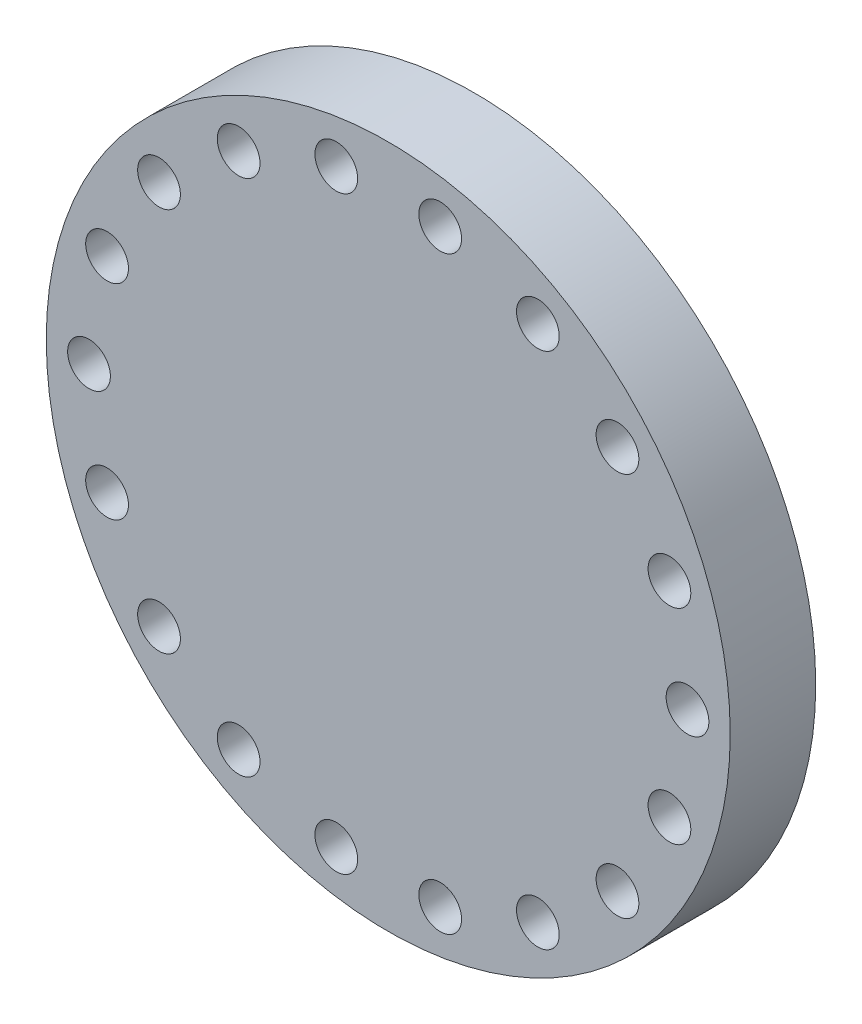
ISO-10303-21;
HEADER;
FILE_DESCRIPTION(('STEP AP214'),'2;1');
FILE_NAME('part.step','',(''),(''),'','','');
FILE_SCHEMA(('AUTOMOTIVE_DESIGN { 1 0 10303 214 1 1 1 1 }'));
ENDSEC;
DATA;
#1=APPLICATION_CONTEXT('core data for automotive mechanical design processes');
#2=APPLICATION_PROTOCOL_DEFINITION('international standard','automotive_design',2000,#1);
#3=PRODUCT_CONTEXT('',#1,'mechanical');
#4=PRODUCT('Part','Part','',(#3));
#5=PRODUCT_RELATED_PRODUCT_CATEGORY('part','',(#4));
#6=PRODUCT_DEFINITION_FORMATION('','',#4);
#7=PRODUCT_DEFINITION_CONTEXT('part definition',#1,'design');
#8=PRODUCT_DEFINITION('design','',#6,#7);
#9=PRODUCT_DEFINITION_SHAPE('','',#8);
#10=(LENGTH_UNIT() NAMED_UNIT(*) SI_UNIT(.MILLI.,.METRE.));
#11=(NAMED_UNIT(*) PLANE_ANGLE_UNIT() SI_UNIT($,.RADIAN.));
#12=(NAMED_UNIT(*) SI_UNIT($,.STERADIAN.) SOLID_ANGLE_UNIT());
#13=UNCERTAINTY_MEASURE_WITH_UNIT(LENGTH_MEASURE(1.E-05),#10,'distance_accuracy_value','');
#14=(GEOMETRIC_REPRESENTATION_CONTEXT(3) GLOBAL_UNCERTAINTY_ASSIGNED_CONTEXT((#13)) GLOBAL_UNIT_ASSIGNED_CONTEXT((#10,
#11,#12)) REPRESENTATION_CONTEXT('',''));
#15=CARTESIAN_POINT('',(0.,0.,0.));
#16=DIRECTION('',(0.,0.,1.));
#17=DIRECTION('',(1.,0.,0.));
#18=AXIS2_PLACEMENT_3D('',#15,#16,#17);
#19=CARTESIAN_POINT('',(0.,0.,-12.7));
#20=DIRECTION('',(0.,0.,1.));
#21=DIRECTION('',(1.,0.,0.));
#22=AXIS2_PLACEMENT_3D('',#19,#20,#21);
#23=CYLINDRICAL_SURFACE('',#22,50.8);
#24=CARTESIAN_POINT('',(0.,0.,-12.7));
#25=DIRECTION('',(0.,0.,1.));
#26=DIRECTION('',(1.,0.,0.));
#27=AXIS2_PLACEMENT_3D('',#24,#25,#26);
#28=CIRCLE('',#27,50.8);
#29=CARTESIAN_POINT('',(50.8,0.,-12.7));
#30=VERTEX_POINT('',#29);
#31=EDGE_CURVE('E10',#30,#30,#28,.T.);
#32=ORIENTED_EDGE('',*,*,#31,.T.);
#33=EDGE_LOOP('',(#32));
#34=FACE_BOUND('',#33,.T.);
#35=CARTESIAN_POINT('',(0.,0.,0.));
#36=DIRECTION('',(0.,0.,1.));
#37=DIRECTION('',(1.,0.,0.));
#38=AXIS2_PLACEMENT_3D('',#35,#36,#37);
#39=CIRCLE('',#38,50.8);
#40=CARTESIAN_POINT('',(50.8,0.,0.));
#41=VERTEX_POINT('',#40);
#42=EDGE_CURVE('E43',#41,#41,#39,.T.);
#43=ORIENTED_EDGE('',*,*,#42,.F.);
#44=EDGE_LOOP('',(#43));
#45=FACE_BOUND('',#44,.T.);
#46=ADVANCED_FACE('F40',(#34,#45),#23,.T.);
#47=CARTESIAN_POINT('',(0.,0.,-12.7));
#48=DIRECTION('',(0.,0.,1.));
#49=DIRECTION('',(1.,0.,0.));
#50=AXIS2_PLACEMENT_3D('',#47,#48,#49);
#51=PLANE('',#50);
#52=CARTESIAN_POINT('',(-41.7693369939334,15.2027953708266,-12.7));
#53=DIRECTION('',(0.,0.,1.));
#54=DIRECTION('',(1.,0.,0.));
#55=AXIS2_PLACEMENT_3D('',#52,#53,#54);
#56=CIRCLE('',#55,3.175);
#57=CARTESIAN_POINT('',(-38.5943369939334,15.2027953708266,-12.7));
#58=VERTEX_POINT('',#57);
#59=EDGE_CURVE('E149',#58,#58,#56,.T.);
#60=ORIENTED_EDGE('',*,*,#59,.T.);
#61=EDGE_LOOP('',(#60));
#62=FACE_BOUND('',#61,.T.);
#63=CARTESIAN_POINT('',(-34.0506754966385,28.5719092505667,-12.7));
#64=DIRECTION('',(0.,0.,1.));
#65=DIRECTION('',(1.,0.,0.));
#66=AXIS2_PLACEMENT_3D('',#63,#64,#65);
#67=CIRCLE('',#66,3.17499999999999);
#68=CARTESIAN_POINT('',(-30.8756754966385,28.5719092505667,-12.7));
#69=VERTEX_POINT('',#68);
#70=EDGE_CURVE('E143',#69,#69,#67,.T.);
#71=ORIENTED_EDGE('',*,*,#70,.T.);
#72=EDGE_LOOP('',(#71));
#73=FACE_BOUND('',#72,.T.);
#74=CARTESIAN_POINT('',(-22.2249999999999,38.4948291982184,-12.7));
#75=DIRECTION('',(0.,0.,1.));
#76=DIRECTION('',(1.,0.,0.));
#77=AXIS2_PLACEMENT_3D('',#74,#75,#76);
#78=CIRCLE('',#77,3.175);
#79=CARTESIAN_POINT('',(-19.0499999999999,38.4948291982184,-12.7));
#80=VERTEX_POINT('',#79);
#81=EDGE_CURVE('E137',#80,#80,#78,.T.);
#82=ORIENTED_EDGE('',*,*,#81,.T.);
#83=EDGE_LOOP('',(#82));
#84=FACE_BOUND('',#83,.T.);
#85=CARTESIAN_POINT('',(-7.71866149729492,43.7747046213927,-12.7));
#86=DIRECTION('',(0.,0.,1.));
#87=DIRECTION('',(1.,0.,0.));
#88=AXIS2_PLACEMENT_3D('',#85,#86,#87);
#89=CIRCLE('',#88,3.17499999999999);
#90=CARTESIAN_POINT('',(-4.54366149729493,43.7747046213927,-12.7));
#91=VERTEX_POINT('',#90);
#92=EDGE_CURVE('E131',#91,#91,#89,.T.);
#93=ORIENTED_EDGE('',*,*,#92,.T.);
#94=EDGE_LOOP('',(#93));
#95=FACE_BOUND('',#94,.T.);
#96=CARTESIAN_POINT('',(7.71866149729522,43.7747046213926,-12.7));
#97=DIRECTION('',(0.,0.,1.));
#98=DIRECTION('',(1.,0.,0.));
#99=AXIS2_PLACEMENT_3D('',#96,#97,#98);
#100=CIRCLE('',#99,3.17499999999999);
#101=CARTESIAN_POINT('',(10.8936614972952,43.7747046213926,-12.7));
#102=VERTEX_POINT('',#101);
#103=EDGE_CURVE('E125',#102,#102,#100,.T.);
#104=ORIENTED_EDGE('',*,*,#103,.T.);
#105=EDGE_LOOP('',(#104));
#106=FACE_BOUND('',#105,.T.);
#107=CARTESIAN_POINT('',(22.2250000000002,38.4948291982182,-12.7));
#108=DIRECTION('',(0.,0.,1.));
#109=DIRECTION('',(1.,0.,0.));
#110=AXIS2_PLACEMENT_3D('',#107,#108,#109);
#111=CIRCLE('',#110,3.17500000000001);
#112=CARTESIAN_POINT('',(25.4000000000002,38.4948291982182,-12.7));
#113=VERTEX_POINT('',#112);
#114=EDGE_CURVE('E119',#113,#113,#111,.T.);
#115=ORIENTED_EDGE('',*,*,#114,.T.);
#116=EDGE_LOOP('',(#115));
#117=FACE_BOUND('',#116,.T.);
#118=CARTESIAN_POINT('',(34.0506754966387,28.5719092505665,-12.7));
#119=DIRECTION('',(0.,0.,1.));
#120=DIRECTION('',(1.,0.,0.));
#121=AXIS2_PLACEMENT_3D('',#118,#119,#120);
#122=CIRCLE('',#121,3.175);
#123=CARTESIAN_POINT('',(37.2256754966387,28.5719092505665,-12.7));
#124=VERTEX_POINT('',#123);
#125=EDGE_CURVE('E113',#124,#124,#122,.T.);
#126=ORIENTED_EDGE('',*,*,#125,.T.);
#127=EDGE_LOOP('',(#126));
#128=FACE_BOUND('',#127,.T.);
#129=CARTESIAN_POINT('',(41.7693369939337,15.2027953708257,-12.7));
#130=DIRECTION('',(0.,0.,1.));
#131=DIRECTION('',(1.,0.,0.));
#132=AXIS2_PLACEMENT_3D('',#129,#130,#131);
#133=CIRCLE('',#132,3.17499999999999);
#134=CARTESIAN_POINT('',(44.9443369939337,15.2027953708257,-12.7));
#135=VERTEX_POINT('',#134);
#136=EDGE_CURVE('E107',#135,#135,#133,.T.);
#137=ORIENTED_EDGE('',*,*,#136,.T.);
#138=EDGE_LOOP('',(#137));
#139=FACE_BOUND('',#138,.T.);
#140=CARTESIAN_POINT('',(44.45,-3.10392691023155E-13,-12.7));
#141=DIRECTION('',(0.,0.,1.));
#142=DIRECTION('',(1.,0.,0.));
#143=AXIS2_PLACEMENT_3D('',#140,#141,#142);
#144=CIRCLE('',#143,3.175);
#145=CARTESIAN_POINT('',(47.625,-3.10392691023155E-13,-12.7));
#146=VERTEX_POINT('',#145);
#147=EDGE_CURVE('E101',#146,#146,#144,.T.);
#148=ORIENTED_EDGE('',*,*,#147,.T.);
#149=EDGE_LOOP('',(#148));
#150=FACE_BOUND('',#149,.T.);
#151=CARTESIAN_POINT('',(41.7693369939335,-15.2027953708263,-12.7));
#152=DIRECTION('',(0.,0.,1.));
#153=DIRECTION('',(1.,0.,0.));
#154=AXIS2_PLACEMENT_3D('',#151,#152,#153);
#155=CIRCLE('',#154,3.17499999999999);
#156=CARTESIAN_POINT('',(44.9443369939335,-15.2027953708263,-12.7));
#157=VERTEX_POINT('',#156);
#158=EDGE_CURVE('E95',#157,#157,#155,.T.);
#159=ORIENTED_EDGE('',*,*,#158,.T.);
#160=EDGE_LOOP('',(#159));
#161=FACE_BOUND('',#160,.T.);
#162=CARTESIAN_POINT('',(34.0506754966383,-28.571909250567,-12.7));
#163=DIRECTION('',(0.,0.,1.));
#164=DIRECTION('',(1.,0.,0.));
#165=AXIS2_PLACEMENT_3D('',#162,#163,#164);
#166=CIRCLE('',#165,3.175);
#167=CARTESIAN_POINT('',(37.2256754966383,-28.571909250567,-12.7));
#168=VERTEX_POINT('',#167);
#169=EDGE_CURVE('E89',#168,#168,#166,.T.);
#170=ORIENTED_EDGE('',*,*,#169,.T.);
#171=EDGE_LOOP('',(#170));
#172=FACE_BOUND('',#171,.T.);
#173=CARTESIAN_POINT('',(22.2249999999996,-38.4948291982185,-12.7));
#174=DIRECTION('',(0.,0.,1.));
#175=DIRECTION('',(1.,0.,0.));
#176=AXIS2_PLACEMENT_3D('',#173,#174,#175);
#177=CIRCLE('',#176,3.175);
#178=CARTESIAN_POINT('',(25.3999999999996,-38.4948291982185,-12.7));
#179=VERTEX_POINT('',#178);
#180=EDGE_CURVE('E83',#179,#179,#177,.T.);
#181=ORIENTED_EDGE('',*,*,#180,.T.);
#182=EDGE_LOOP('',(#181));
#183=FACE_BOUND('',#182,.T.);
#184=CARTESIAN_POINT('',(7.71866149729463,-43.7747046213927,-12.7));
#185=DIRECTION('',(0.,0.,1.));
#186=DIRECTION('',(1.,0.,0.));
#187=AXIS2_PLACEMENT_3D('',#184,#185,#186);
#188=CIRCLE('',#187,3.175);
#189=CARTESIAN_POINT('',(10.8936614972946,-43.7747046213927,-12.7));
#190=VERTEX_POINT('',#189);
#191=EDGE_CURVE('E77',#190,#190,#188,.T.);
#192=ORIENTED_EDGE('',*,*,#191,.T.);
#193=EDGE_LOOP('',(#192));
#194=FACE_BOUND('',#193,.T.);
#195=CARTESIAN_POINT('',(-7.71866149729551,-43.7747046213926,-12.7));
#196=DIRECTION('',(0.,0.,1.));
#197=DIRECTION('',(1.,0.,0.));
#198=AXIS2_PLACEMENT_3D('',#195,#196,#197);
#199=CIRCLE('',#198,3.175);
#200=CARTESIAN_POINT('',(-4.54366149729551,-43.7747046213926,-12.7));
#201=VERTEX_POINT('',#200);
#202=EDGE_CURVE('E71',#201,#201,#199,.T.);
#203=ORIENTED_EDGE('',*,*,#202,.T.);
#204=EDGE_LOOP('',(#203));
#205=FACE_BOUND('',#204,.T.);
#206=CARTESIAN_POINT('',(-22.2250000000005,-38.494829198218,-12.7));
#207=DIRECTION('',(0.,0.,1.));
#208=DIRECTION('',(1.,0.,0.));
#209=AXIS2_PLACEMENT_3D('',#206,#207,#208);
#210=CIRCLE('',#209,3.175);
#211=CARTESIAN_POINT('',(-19.0500000000005,-38.494829198218,-12.7));
#212=VERTEX_POINT('',#211);
#213=EDGE_CURVE('E65',#212,#212,#210,.T.);
#214=ORIENTED_EDGE('',*,*,#213,.T.);
#215=EDGE_LOOP('',(#214));
#216=FACE_BOUND('',#215,.T.);
#217=CARTESIAN_POINT('',(-34.0506754966389,-28.5719092505663,-12.7));
#218=DIRECTION('',(0.,0.,1.));
#219=DIRECTION('',(1.,0.,0.));
#220=AXIS2_PLACEMENT_3D('',#217,#218,#219);
#221=CIRCLE('',#220,3.17499999999999);
#222=CARTESIAN_POINT('',(-30.8756754966389,-28.5719092505663,-12.7));
#223=VERTEX_POINT('',#222);
#224=EDGE_CURVE('E58',#223,#223,#221,.T.);
#225=ORIENTED_EDGE('',*,*,#224,.T.);
#226=EDGE_LOOP('',(#225));
#227=FACE_BOUND('',#226,.T.);
#228=CARTESIAN_POINT('',(-41.7693369939338,-15.2027953708255,-12.7));
#229=DIRECTION('',(0.,0.,1.));
#230=DIRECTION('',(1.,0.,0.));
#231=AXIS2_PLACEMENT_3D('',#228,#229,#230);
#232=CIRCLE('',#231,3.17499999999999);
#233=CARTESIAN_POINT('',(-38.5943369939338,-15.2027953708255,-12.7));
#234=VERTEX_POINT('',#233);
#235=EDGE_CURVE('E154',#234,#234,#232,.T.);
#236=ORIENTED_EDGE('',*,*,#235,.T.);
#237=EDGE_LOOP('',(#236));
#238=FACE_BOUND('',#237,.T.);
#239=CARTESIAN_POINT('',(-44.45,0.,-12.7));
#240=DIRECTION('',(0.,0.,1.));
#241=DIRECTION('',(1.,0.,0.));
#242=AXIS2_PLACEMENT_3D('',#239,#240,#241);
#243=CIRCLE('',#242,3.175);
#244=CARTESIAN_POINT('',(-41.275,0.,-12.7));
#245=VERTEX_POINT('',#244);
#246=EDGE_CURVE('E50',#245,#245,#243,.T.);
#247=ORIENTED_EDGE('',*,*,#246,.T.);
#248=EDGE_LOOP('',(#247));
#249=FACE_BOUND('',#248,.T.);
#250=ORIENTED_EDGE('',*,*,#31,.F.);
#251=EDGE_LOOP('',(#250));
#252=FACE_BOUND('',#251,.T.);
#253=ADVANCED_FACE('F166',(#62,#73,#84,#95,#106,#117,#128,#139,#150,#161,#172,#183,#194,#205,
#216,#227,#238,#249,#252),#51,.F.);
#254=CARTESIAN_POINT('',(0.,0.,0.));
#255=DIRECTION('',(0.,0.,1.));
#256=DIRECTION('',(1.,0.,0.));
#257=AXIS2_PLACEMENT_3D('',#254,#255,#256);
#258=PLANE('',#257);
#259=CARTESIAN_POINT('',(-41.7693369939334,15.2027953708266,0.));
#260=DIRECTION('',(0.,0.,1.));
#261=DIRECTION('',(1.,0.,0.));
#262=AXIS2_PLACEMENT_3D('',#259,#260,#261);
#263=CIRCLE('',#262,3.175);
#264=CARTESIAN_POINT('',(-38.5943369939334,15.2027953708266,0.));
#265=VERTEX_POINT('',#264);
#266=EDGE_CURVE('E55',#265,#265,#263,.T.);
#267=ORIENTED_EDGE('',*,*,#266,.F.);
#268=EDGE_LOOP('',(#267));
#269=FACE_BOUND('',#268,.T.);
#270=CARTESIAN_POINT('',(-34.0506754966385,28.5719092505667,0.));
#271=DIRECTION('',(0.,0.,1.));
#272=DIRECTION('',(1.,0.,0.));
#273=AXIS2_PLACEMENT_3D('',#270,#271,#272);
#274=CIRCLE('',#273,3.17499999999999);
#275=CARTESIAN_POINT('',(-30.8756754966385,28.5719092505667,0.));
#276=VERTEX_POINT('',#275);
#277=EDGE_CURVE('E146',#276,#276,#274,.T.);
#278=ORIENTED_EDGE('',*,*,#277,.F.);
#279=EDGE_LOOP('',(#278));
#280=FACE_BOUND('',#279,.T.);
#281=CARTESIAN_POINT('',(-22.2249999999999,38.4948291982184,0.));
#282=DIRECTION('',(0.,0.,1.));
#283=DIRECTION('',(1.,0.,0.));
#284=AXIS2_PLACEMENT_3D('',#281,#282,#283);
#285=CIRCLE('',#284,3.175);
#286=CARTESIAN_POINT('',(-19.0499999999999,38.4948291982184,0.));
#287=VERTEX_POINT('',#286);
#288=EDGE_CURVE('E140',#287,#287,#285,.T.);
#289=ORIENTED_EDGE('',*,*,#288,.F.);
#290=EDGE_LOOP('',(#289));
#291=FACE_BOUND('',#290,.T.);
#292=CARTESIAN_POINT('',(-7.71866149729492,43.7747046213927,0.));
#293=DIRECTION('',(0.,0.,1.));
#294=DIRECTION('',(1.,0.,0.));
#295=AXIS2_PLACEMENT_3D('',#292,#293,#294);
#296=CIRCLE('',#295,3.17499999999999);
#297=CARTESIAN_POINT('',(-4.54366149729493,43.7747046213927,0.));
#298=VERTEX_POINT('',#297);
#299=EDGE_CURVE('E134',#298,#298,#296,.T.);
#300=ORIENTED_EDGE('',*,*,#299,.F.);
#301=EDGE_LOOP('',(#300));
#302=FACE_BOUND('',#301,.T.);
#303=CARTESIAN_POINT('',(7.71866149729522,43.7747046213926,0.));
#304=DIRECTION('',(0.,0.,1.));
#305=DIRECTION('',(1.,0.,0.));
#306=AXIS2_PLACEMENT_3D('',#303,#304,#305);
#307=CIRCLE('',#306,3.17499999999999);
#308=CARTESIAN_POINT('',(10.8936614972952,43.7747046213926,0.));
#309=VERTEX_POINT('',#308);
#310=EDGE_CURVE('E128',#309,#309,#307,.T.);
#311=ORIENTED_EDGE('',*,*,#310,.F.);
#312=EDGE_LOOP('',(#311));
#313=FACE_BOUND('',#312,.T.);
#314=CARTESIAN_POINT('',(22.2250000000002,38.4948291982182,0.));
#315=DIRECTION('',(0.,0.,1.));
#316=DIRECTION('',(1.,0.,0.));
#317=AXIS2_PLACEMENT_3D('',#314,#315,#316);
#318=CIRCLE('',#317,3.17500000000001);
#319=CARTESIAN_POINT('',(25.4000000000002,38.4948291982182,0.));
#320=VERTEX_POINT('',#319);
#321=EDGE_CURVE('E122',#320,#320,#318,.T.);
#322=ORIENTED_EDGE('',*,*,#321,.F.);
#323=EDGE_LOOP('',(#322));
#324=FACE_BOUND('',#323,.T.);
#325=CARTESIAN_POINT('',(34.0506754966387,28.5719092505665,0.));
#326=DIRECTION('',(0.,0.,1.));
#327=DIRECTION('',(1.,0.,0.));
#328=AXIS2_PLACEMENT_3D('',#325,#326,#327);
#329=CIRCLE('',#328,3.175);
#330=CARTESIAN_POINT('',(37.2256754966387,28.5719092505665,0.));
#331=VERTEX_POINT('',#330);
#332=EDGE_CURVE('E116',#331,#331,#329,.T.);
#333=ORIENTED_EDGE('',*,*,#332,.F.);
#334=EDGE_LOOP('',(#333));
#335=FACE_BOUND('',#334,.T.);
#336=CARTESIAN_POINT('',(41.7693369939337,15.2027953708257,0.));
#337=DIRECTION('',(0.,0.,1.));
#338=DIRECTION('',(1.,0.,0.));
#339=AXIS2_PLACEMENT_3D('',#336,#337,#338);
#340=CIRCLE('',#339,3.17499999999999);
#341=CARTESIAN_POINT('',(44.9443369939337,15.2027953708257,0.));
#342=VERTEX_POINT('',#341);
#343=EDGE_CURVE('E110',#342,#342,#340,.T.);
#344=ORIENTED_EDGE('',*,*,#343,.F.);
#345=EDGE_LOOP('',(#344));
#346=FACE_BOUND('',#345,.T.);
#347=CARTESIAN_POINT('',(44.45,-3.10392691023155E-13,0.));
#348=DIRECTION('',(0.,0.,1.));
#349=DIRECTION('',(1.,0.,0.));
#350=AXIS2_PLACEMENT_3D('',#347,#348,#349);
#351=CIRCLE('',#350,3.175);
#352=CARTESIAN_POINT('',(47.625,-3.10392691023155E-13,0.));
#353=VERTEX_POINT('',#352);
#354=EDGE_CURVE('E104',#353,#353,#351,.T.);
#355=ORIENTED_EDGE('',*,*,#354,.F.);
#356=EDGE_LOOP('',(#355));
#357=FACE_BOUND('',#356,.T.);
#358=CARTESIAN_POINT('',(41.7693369939335,-15.2027953708263,0.));
#359=DIRECTION('',(0.,0.,1.));
#360=DIRECTION('',(1.,0.,0.));
#361=AXIS2_PLACEMENT_3D('',#358,#359,#360);
#362=CIRCLE('',#361,3.17499999999999);
#363=CARTESIAN_POINT('',(44.9443369939335,-15.2027953708263,0.));
#364=VERTEX_POINT('',#363);
#365=EDGE_CURVE('E98',#364,#364,#362,.T.);
#366=ORIENTED_EDGE('',*,*,#365,.F.);
#367=EDGE_LOOP('',(#366));
#368=FACE_BOUND('',#367,.T.);
#369=CARTESIAN_POINT('',(34.0506754966383,-28.571909250567,0.));
#370=DIRECTION('',(0.,0.,1.));
#371=DIRECTION('',(1.,0.,0.));
#372=AXIS2_PLACEMENT_3D('',#369,#370,#371);
#373=CIRCLE('',#372,3.175);
#374=CARTESIAN_POINT('',(37.2256754966383,-28.571909250567,0.));
#375=VERTEX_POINT('',#374);
#376=EDGE_CURVE('E92',#375,#375,#373,.T.);
#377=ORIENTED_EDGE('',*,*,#376,.F.);
#378=EDGE_LOOP('',(#377));
#379=FACE_BOUND('',#378,.T.);
#380=CARTESIAN_POINT('',(22.2249999999996,-38.4948291982185,0.));
#381=DIRECTION('',(0.,0.,1.));
#382=DIRECTION('',(1.,0.,0.));
#383=AXIS2_PLACEMENT_3D('',#380,#381,#382);
#384=CIRCLE('',#383,3.175);
#385=CARTESIAN_POINT('',(25.3999999999996,-38.4948291982185,0.));
#386=VERTEX_POINT('',#385);
#387=EDGE_CURVE('E86',#386,#386,#384,.T.);
#388=ORIENTED_EDGE('',*,*,#387,.F.);
#389=EDGE_LOOP('',(#388));
#390=FACE_BOUND('',#389,.T.);
#391=CARTESIAN_POINT('',(7.71866149729463,-43.7747046213927,0.));
#392=DIRECTION('',(0.,0.,1.));
#393=DIRECTION('',(1.,0.,0.));
#394=AXIS2_PLACEMENT_3D('',#391,#392,#393);
#395=CIRCLE('',#394,3.175);
#396=CARTESIAN_POINT('',(10.8936614972946,-43.7747046213927,0.));
#397=VERTEX_POINT('',#396);
#398=EDGE_CURVE('E80',#397,#397,#395,.T.);
#399=ORIENTED_EDGE('',*,*,#398,.F.);
#400=EDGE_LOOP('',(#399));
#401=FACE_BOUND('',#400,.T.);
#402=CARTESIAN_POINT('',(-7.71866149729551,-43.7747046213926,0.));
#403=DIRECTION('',(0.,0.,1.));
#404=DIRECTION('',(1.,0.,0.));
#405=AXIS2_PLACEMENT_3D('',#402,#403,#404);
#406=CIRCLE('',#405,3.175);
#407=CARTESIAN_POINT('',(-4.54366149729551,-43.7747046213926,0.));
#408=VERTEX_POINT('',#407);
#409=EDGE_CURVE('E74',#408,#408,#406,.T.);
#410=ORIENTED_EDGE('',*,*,#409,.F.);
#411=EDGE_LOOP('',(#410));
#412=FACE_BOUND('',#411,.T.);
#413=CARTESIAN_POINT('',(-22.2250000000005,-38.494829198218,0.));
#414=DIRECTION('',(0.,0.,1.));
#415=DIRECTION('',(1.,0.,0.));
#416=AXIS2_PLACEMENT_3D('',#413,#414,#415);
#417=CIRCLE('',#416,3.175);
#418=CARTESIAN_POINT('',(-19.0500000000005,-38.494829198218,0.));
#419=VERTEX_POINT('',#418);
#420=EDGE_CURVE('E68',#419,#419,#417,.T.);
#421=ORIENTED_EDGE('',*,*,#420,.F.);
#422=EDGE_LOOP('',(#421));
#423=FACE_BOUND('',#422,.T.);
#424=CARTESIAN_POINT('',(-34.0506754966389,-28.5719092505663,0.));
#425=DIRECTION('',(0.,0.,1.));
#426=DIRECTION('',(1.,0.,0.));
#427=AXIS2_PLACEMENT_3D('',#424,#425,#426);
#428=CIRCLE('',#427,3.17499999999999);
#429=CARTESIAN_POINT('',(-30.8756754966389,-28.5719092505663,0.));
#430=VERTEX_POINT('',#429);
#431=EDGE_CURVE('E61',#430,#430,#428,.T.);
#432=ORIENTED_EDGE('',*,*,#431,.F.);
#433=EDGE_LOOP('',(#432));
#434=FACE_BOUND('',#433,.T.);
#435=CARTESIAN_POINT('',(-41.7693369939338,-15.2027953708255,0.));
#436=DIRECTION('',(0.,0.,1.));
#437=DIRECTION('',(1.,0.,0.));
#438=AXIS2_PLACEMENT_3D('',#435,#436,#437);
#439=CIRCLE('',#438,3.17499999999999);
#440=CARTESIAN_POINT('',(-38.5943369939338,-15.2027953708255,0.));
#441=VERTEX_POINT('',#440);
#442=EDGE_CURVE('E62',#441,#441,#439,.T.);
#443=ORIENTED_EDGE('',*,*,#442,.F.);
#444=EDGE_LOOP('',(#443));
#445=FACE_BOUND('',#444,.T.);
#446=CARTESIAN_POINT('',(-44.45,0.,0.));
#447=DIRECTION('',(0.,0.,1.));
#448=DIRECTION('',(1.,0.,0.));
#449=AXIS2_PLACEMENT_3D('',#446,#447,#448);
#450=CIRCLE('',#449,3.175);
#451=CARTESIAN_POINT('',(-41.275,0.,0.));
#452=VERTEX_POINT('',#451);
#453=EDGE_CURVE('E52',#452,#452,#450,.T.);
#454=ORIENTED_EDGE('',*,*,#453,.F.);
#455=EDGE_LOOP('',(#454));
#456=FACE_BOUND('',#455,.T.);
#457=ORIENTED_EDGE('',*,*,#42,.T.);
#458=EDGE_LOOP('',(#457));
#459=FACE_BOUND('',#458,.T.);
#460=ADVANCED_FACE('F162',(#269,#280,#291,#302,#313,#324,#335,#346,#357,#368,#379,#390,#401,
#412,#423,#434,#445,#456,#459),#258,.T.);
#461=CARTESIAN_POINT('',(-44.45,0.,-12.7));
#462=DIRECTION('',(0.,0.,1.));
#463=DIRECTION('',(1.,0.,0.));
#464=AXIS2_PLACEMENT_3D('',#461,#462,#463);
#465=CYLINDRICAL_SURFACE('',#464,3.175);
#466=ORIENTED_EDGE('',*,*,#246,.F.);
#467=EDGE_LOOP('',(#466));
#468=FACE_BOUND('',#467,.T.);
#469=ORIENTED_EDGE('',*,*,#453,.T.);
#470=EDGE_LOOP('',(#469));
#471=FACE_BOUND('',#470,.T.);
#472=ADVANCED_FACE('F165',(#468,#471),#465,.F.);
#473=CARTESIAN_POINT('',(-41.7693369939338,-15.2027953708255,-12.7));
#474=DIRECTION('',(0.,0.,1.));
#475=DIRECTION('',(1.,0.,0.));
#476=AXIS2_PLACEMENT_3D('',#473,#474,#475);
#477=CYLINDRICAL_SURFACE('',#476,3.17499999999999);
#478=ORIENTED_EDGE('',*,*,#235,.F.);
#479=EDGE_LOOP('',(#478));
#480=FACE_BOUND('',#479,.T.);
#481=ORIENTED_EDGE('',*,*,#442,.T.);
#482=EDGE_LOOP('',(#481));
#483=FACE_BOUND('',#482,.T.);
#484=ADVANCED_FACE('F160',(#480,#483),#477,.F.);
#485=CARTESIAN_POINT('',(-34.0506754966389,-28.5719092505663,-12.7));
#486=DIRECTION('',(0.,0.,1.));
#487=DIRECTION('',(1.,0.,0.));
#488=AXIS2_PLACEMENT_3D('',#485,#486,#487);
#489=CYLINDRICAL_SURFACE('',#488,3.17499999999999);
#490=ORIENTED_EDGE('',*,*,#224,.F.);
#491=EDGE_LOOP('',(#490));
#492=FACE_BOUND('',#491,.T.);
#493=ORIENTED_EDGE('',*,*,#431,.T.);
#494=EDGE_LOOP('',(#493));
#495=FACE_BOUND('',#494,.T.);
#496=ADVANCED_FACE('F185',(#492,#495),#489,.F.);
#497=CARTESIAN_POINT('',(-22.2250000000005,-38.494829198218,-12.7));
#498=DIRECTION('',(0.,0.,1.));
#499=DIRECTION('',(1.,0.,0.));
#500=AXIS2_PLACEMENT_3D('',#497,#498,#499);
#501=CYLINDRICAL_SURFACE('',#500,3.175);
#502=ORIENTED_EDGE('',*,*,#213,.F.);
#503=EDGE_LOOP('',(#502));
#504=FACE_BOUND('',#503,.T.);
#505=ORIENTED_EDGE('',*,*,#420,.T.);
#506=EDGE_LOOP('',(#505));
#507=FACE_BOUND('',#506,.T.);
#508=ADVANCED_FACE('F188',(#504,#507),#501,.F.);
#509=CARTESIAN_POINT('',(-7.71866149729551,-43.7747046213926,-12.7));
#510=DIRECTION('',(0.,0.,1.));
#511=DIRECTION('',(1.,0.,0.));
#512=AXIS2_PLACEMENT_3D('',#509,#510,#511);
#513=CYLINDRICAL_SURFACE('',#512,3.175);
#514=ORIENTED_EDGE('',*,*,#202,.F.);
#515=EDGE_LOOP('',(#514));
#516=FACE_BOUND('',#515,.T.);
#517=ORIENTED_EDGE('',*,*,#409,.T.);
#518=EDGE_LOOP('',(#517));
#519=FACE_BOUND('',#518,.T.);
#520=ADVANCED_FACE('F192',(#516,#519),#513,.F.);
#521=CARTESIAN_POINT('',(7.71866149729463,-43.7747046213927,-12.7));
#522=DIRECTION('',(0.,0.,1.));
#523=DIRECTION('',(1.,0.,0.));
#524=AXIS2_PLACEMENT_3D('',#521,#522,#523);
#525=CYLINDRICAL_SURFACE('',#524,3.175);
#526=ORIENTED_EDGE('',*,*,#191,.F.);
#527=EDGE_LOOP('',(#526));
#528=FACE_BOUND('',#527,.T.);
#529=ORIENTED_EDGE('',*,*,#398,.T.);
#530=EDGE_LOOP('',(#529));
#531=FACE_BOUND('',#530,.T.);
#532=ADVANCED_FACE('F196',(#528,#531),#525,.F.);
#533=CARTESIAN_POINT('',(22.2249999999996,-38.4948291982185,-12.7));
#534=DIRECTION('',(0.,0.,1.));
#535=DIRECTION('',(1.,0.,0.));
#536=AXIS2_PLACEMENT_3D('',#533,#534,#535);
#537=CYLINDRICAL_SURFACE('',#536,3.175);
#538=ORIENTED_EDGE('',*,*,#180,.F.);
#539=EDGE_LOOP('',(#538));
#540=FACE_BOUND('',#539,.T.);
#541=ORIENTED_EDGE('',*,*,#387,.T.);
#542=EDGE_LOOP('',(#541));
#543=FACE_BOUND('',#542,.T.);
#544=ADVANCED_FACE('F200',(#540,#543),#537,.F.);
#545=CARTESIAN_POINT('',(34.0506754966383,-28.571909250567,-12.7));
#546=DIRECTION('',(0.,0.,1.));
#547=DIRECTION('',(1.,0.,0.));
#548=AXIS2_PLACEMENT_3D('',#545,#546,#547);
#549=CYLINDRICAL_SURFACE('',#548,3.175);
#550=ORIENTED_EDGE('',*,*,#169,.F.);
#551=EDGE_LOOP('',(#550));
#552=FACE_BOUND('',#551,.T.);
#553=ORIENTED_EDGE('',*,*,#376,.T.);
#554=EDGE_LOOP('',(#553));
#555=FACE_BOUND('',#554,.T.);
#556=ADVANCED_FACE('F204',(#552,#555),#549,.F.);
#557=CARTESIAN_POINT('',(41.7693369939335,-15.2027953708263,-12.7));
#558=DIRECTION('',(0.,0.,1.));
#559=DIRECTION('',(1.,0.,0.));
#560=AXIS2_PLACEMENT_3D('',#557,#558,#559);
#561=CYLINDRICAL_SURFACE('',#560,3.17499999999999);
#562=ORIENTED_EDGE('',*,*,#158,.F.);
#563=EDGE_LOOP('',(#562));
#564=FACE_BOUND('',#563,.T.);
#565=ORIENTED_EDGE('',*,*,#365,.T.);
#566=EDGE_LOOP('',(#565));
#567=FACE_BOUND('',#566,.T.);
#568=ADVANCED_FACE('F208',(#564,#567),#561,.F.);
#569=CARTESIAN_POINT('',(44.45,-3.10392691023155E-13,-12.7));
#570=DIRECTION('',(0.,0.,1.));
#571=DIRECTION('',(1.,0.,0.));
#572=AXIS2_PLACEMENT_3D('',#569,#570,#571);
#573=CYLINDRICAL_SURFACE('',#572,3.175);
#574=ORIENTED_EDGE('',*,*,#147,.F.);
#575=EDGE_LOOP('',(#574));
#576=FACE_BOUND('',#575,.T.);
#577=ORIENTED_EDGE('',*,*,#354,.T.);
#578=EDGE_LOOP('',(#577));
#579=FACE_BOUND('',#578,.T.);
#580=ADVANCED_FACE('F212',(#576,#579),#573,.F.);
#581=CARTESIAN_POINT('',(41.7693369939337,15.2027953708257,-12.7));
#582=DIRECTION('',(0.,0.,1.));
#583=DIRECTION('',(1.,0.,0.));
#584=AXIS2_PLACEMENT_3D('',#581,#582,#583);
#585=CYLINDRICAL_SURFACE('',#584,3.17499999999999);
#586=ORIENTED_EDGE('',*,*,#136,.F.);
#587=EDGE_LOOP('',(#586));
#588=FACE_BOUND('',#587,.T.);
#589=ORIENTED_EDGE('',*,*,#343,.T.);
#590=EDGE_LOOP('',(#589));
#591=FACE_BOUND('',#590,.T.);
#592=ADVANCED_FACE('F216',(#588,#591),#585,.F.);
#593=CARTESIAN_POINT('',(34.0506754966387,28.5719092505665,-12.7));
#594=DIRECTION('',(0.,0.,1.));
#595=DIRECTION('',(1.,0.,0.));
#596=AXIS2_PLACEMENT_3D('',#593,#594,#595);
#597=CYLINDRICAL_SURFACE('',#596,3.175);
#598=ORIENTED_EDGE('',*,*,#125,.F.);
#599=EDGE_LOOP('',(#598));
#600=FACE_BOUND('',#599,.T.);
#601=ORIENTED_EDGE('',*,*,#332,.T.);
#602=EDGE_LOOP('',(#601));
#603=FACE_BOUND('',#602,.T.);
#604=ADVANCED_FACE('F220',(#600,#603),#597,.F.);
#605=CARTESIAN_POINT('',(22.2250000000002,38.4948291982182,-12.7));
#606=DIRECTION('',(0.,0.,1.));
#607=DIRECTION('',(1.,0.,0.));
#608=AXIS2_PLACEMENT_3D('',#605,#606,#607);
#609=CYLINDRICAL_SURFACE('',#608,3.17500000000001);
#610=ORIENTED_EDGE('',*,*,#114,.F.);
#611=EDGE_LOOP('',(#610));
#612=FACE_BOUND('',#611,.T.);
#613=ORIENTED_EDGE('',*,*,#321,.T.);
#614=EDGE_LOOP('',(#613));
#615=FACE_BOUND('',#614,.T.);
#616=ADVANCED_FACE('F224',(#612,#615),#609,.F.);
#617=CARTESIAN_POINT('',(7.71866149729522,43.7747046213926,-12.7));
#618=DIRECTION('',(0.,0.,1.));
#619=DIRECTION('',(1.,0.,0.));
#620=AXIS2_PLACEMENT_3D('',#617,#618,#619);
#621=CYLINDRICAL_SURFACE('',#620,3.17499999999999);
#622=ORIENTED_EDGE('',*,*,#103,.F.);
#623=EDGE_LOOP('',(#622));
#624=FACE_BOUND('',#623,.T.);
#625=ORIENTED_EDGE('',*,*,#310,.T.);
#626=EDGE_LOOP('',(#625));
#627=FACE_BOUND('',#626,.T.);
#628=ADVANCED_FACE('F228',(#624,#627),#621,.F.);
#629=CARTESIAN_POINT('',(-7.71866149729492,43.7747046213927,-12.7));
#630=DIRECTION('',(0.,0.,1.));
#631=DIRECTION('',(1.,0.,0.));
#632=AXIS2_PLACEMENT_3D('',#629,#630,#631);
#633=CYLINDRICAL_SURFACE('',#632,3.17499999999999);
#634=ORIENTED_EDGE('',*,*,#92,.F.);
#635=EDGE_LOOP('',(#634));
#636=FACE_BOUND('',#635,.T.);
#637=ORIENTED_EDGE('',*,*,#299,.T.);
#638=EDGE_LOOP('',(#637));
#639=FACE_BOUND('',#638,.T.);
#640=ADVANCED_FACE('F232',(#636,#639),#633,.F.);
#641=CARTESIAN_POINT('',(-22.2249999999999,38.4948291982184,-12.7));
#642=DIRECTION('',(0.,0.,1.));
#643=DIRECTION('',(1.,0.,0.));
#644=AXIS2_PLACEMENT_3D('',#641,#642,#643);
#645=CYLINDRICAL_SURFACE('',#644,3.175);
#646=ORIENTED_EDGE('',*,*,#81,.F.);
#647=EDGE_LOOP('',(#646));
#648=FACE_BOUND('',#647,.T.);
#649=ORIENTED_EDGE('',*,*,#288,.T.);
#650=EDGE_LOOP('',(#649));
#651=FACE_BOUND('',#650,.T.);
#652=ADVANCED_FACE('F236',(#648,#651),#645,.F.);
#653=CARTESIAN_POINT('',(-34.0506754966385,28.5719092505667,-12.7));
#654=DIRECTION('',(0.,0.,1.));
#655=DIRECTION('',(1.,0.,0.));
#656=AXIS2_PLACEMENT_3D('',#653,#654,#655);
#657=CYLINDRICAL_SURFACE('',#656,3.17499999999999);
#658=ORIENTED_EDGE('',*,*,#70,.F.);
#659=EDGE_LOOP('',(#658));
#660=FACE_BOUND('',#659,.T.);
#661=ORIENTED_EDGE('',*,*,#277,.T.);
#662=EDGE_LOOP('',(#661));
#663=FACE_BOUND('',#662,.T.);
#664=ADVANCED_FACE('F240',(#660,#663),#657,.F.);
#665=CARTESIAN_POINT('',(-41.7693369939334,15.2027953708266,-12.7));
#666=DIRECTION('',(0.,0.,1.));
#667=DIRECTION('',(1.,0.,0.));
#668=AXIS2_PLACEMENT_3D('',#665,#666,#667);
#669=CYLINDRICAL_SURFACE('',#668,3.175);
#670=ORIENTED_EDGE('',*,*,#59,.F.);
#671=EDGE_LOOP('',(#670));
#672=FACE_BOUND('',#671,.T.);
#673=ORIENTED_EDGE('',*,*,#266,.T.);
#674=EDGE_LOOP('',(#673));
#675=FACE_BOUND('',#674,.T.);
#676=ADVANCED_FACE('F244',(#672,#675),#669,.F.);
#677=CLOSED_SHELL('',(#46,#253,#460,#472,#484,#496,#508,#520,#532,#544,#556,#568,#580,#592,#604,
#616,#628,#640,#652,#664,#676));
#678=MANIFOLD_SOLID_BREP('B2',#677);
#679=ADVANCED_BREP_SHAPE_REPRESENTATION('',(#18,#678),#14);
#680=SHAPE_DEFINITION_REPRESENTATION(#9,#679);
ENDSEC;
END-ISO-10303-21;
